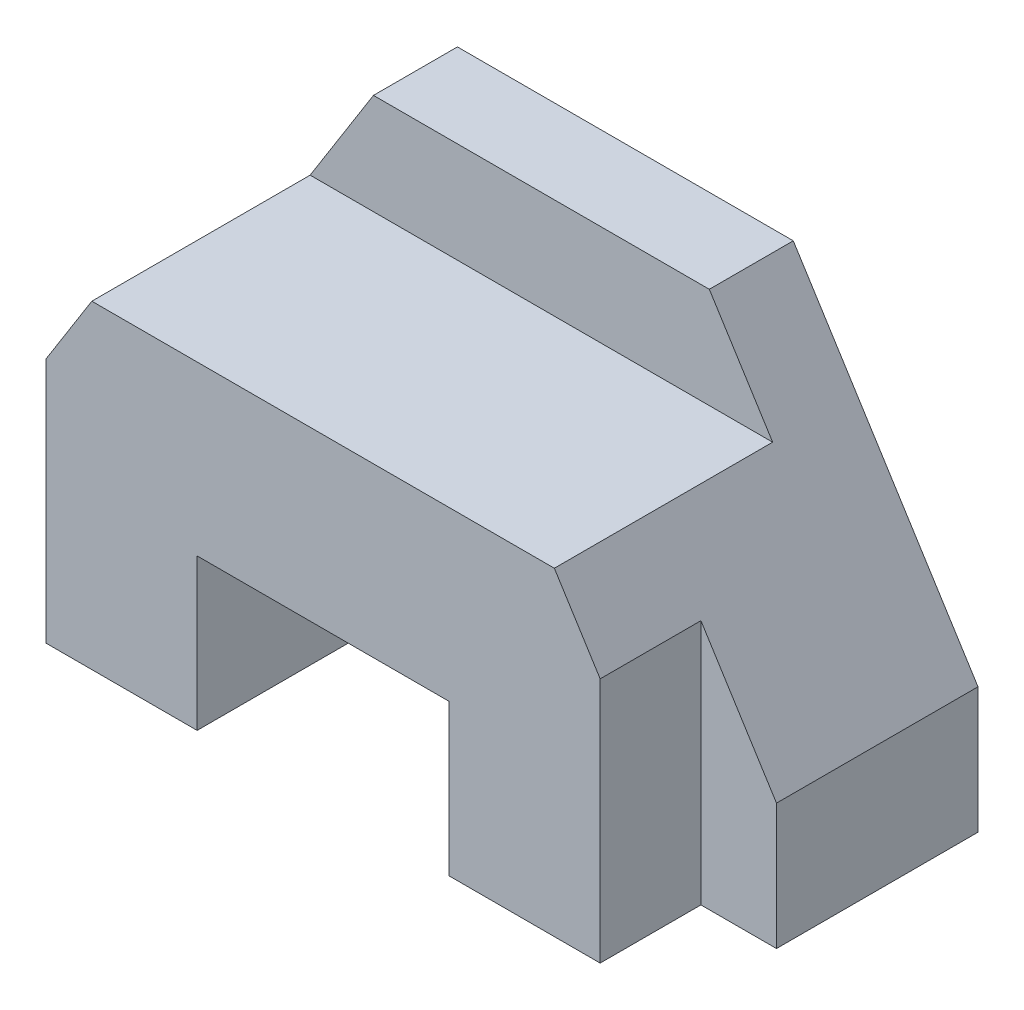
ISO-10303-21;
HEADER;
FILE_DESCRIPTION(('STEP AP214'),'2;1');
FILE_NAME('part.step','',(''),(''),'','','');
FILE_SCHEMA(('AUTOMOTIVE_DESIGN { 1 0 10303 214 1 1 1 1 }'));
ENDSEC;
DATA;
#1=APPLICATION_CONTEXT('core data for automotive mechanical design processes');
#2=APPLICATION_PROTOCOL_DEFINITION('international standard','automotive_design',2000,#1);
#3=PRODUCT_CONTEXT('',#1,'mechanical');
#4=PRODUCT('Part','Part','',(#3));
#5=PRODUCT_RELATED_PRODUCT_CATEGORY('part','',(#4));
#6=PRODUCT_DEFINITION_FORMATION('','',#4);
#7=PRODUCT_DEFINITION_CONTEXT('part definition',#1,'design');
#8=PRODUCT_DEFINITION('design','',#6,#7);
#9=PRODUCT_DEFINITION_SHAPE('','',#8);
#10=(LENGTH_UNIT() NAMED_UNIT(*) SI_UNIT(.MILLI.,.METRE.));
#11=(NAMED_UNIT(*) PLANE_ANGLE_UNIT() SI_UNIT($,.RADIAN.));
#12=(NAMED_UNIT(*) SI_UNIT($,.STERADIAN.) SOLID_ANGLE_UNIT());
#13=UNCERTAINTY_MEASURE_WITH_UNIT(LENGTH_MEASURE(1.E-05),#10,'distance_accuracy_value','');
#14=(GEOMETRIC_REPRESENTATION_CONTEXT(3) GLOBAL_UNCERTAINTY_ASSIGNED_CONTEXT((#13)) GLOBAL_UNIT_ASSIGNED_CONTEXT((#10,
#11,#12)) REPRESENTATION_CONTEXT('',''));
#15=CARTESIAN_POINT('',(0.,0.,0.));
#16=DIRECTION('',(0.,0.,1.));
#17=DIRECTION('',(1.,0.,0.));
#18=AXIS2_PLACEMENT_3D('',#15,#16,#17);
#19=CARTESIAN_POINT('',(-42.,-15.,36.));
#20=DIRECTION('',(0.,1.,0.));
#21=DIRECTION('',(0.,0.,1.));
#22=AXIS2_PLACEMENT_3D('',#19,#20,#21);
#23=PLANE('',#22);
#24=DIRECTION('',(1.,0.,0.));
#25=VECTOR('',#24,1.);
#26=CARTESIAN_POINT('',(-42.,-15.,0.));
#27=LINE('',#26,#25);
#28=CARTESIAN_POINT('',(-42.,-15.,0.));
#29=VERTEX_POINT('',#28);
#30=CARTESIAN_POINT('',(-15.,-15.,0.));
#31=VERTEX_POINT('',#30);
#32=EDGE_CURVE('E166',#29,#31,#27,.T.);
#33=ORIENTED_EDGE('',*,*,#32,.T.);
#34=DIRECTION('',(0.,0.,1.));
#35=VECTOR('',#34,1.);
#36=CARTESIAN_POINT('',(-15.,-15.,0.));
#37=LINE('',#36,#35);
#38=CARTESIAN_POINT('',(-15.,-15.,36.));
#39=VERTEX_POINT('',#38);
#40=EDGE_CURVE('E150',#31,#39,#37,.T.);
#41=ORIENTED_EDGE('',*,*,#40,.T.);
#42=DIRECTION('',(1.,0.,0.));
#43=VECTOR('',#42,1.);
#44=CARTESIAN_POINT('',(-42.,-15.,36.));
#45=LINE('',#44,#43);
#46=CARTESIAN_POINT('',(-33.,-15.,36.));
#47=VERTEX_POINT('',#46);
#48=EDGE_CURVE('E187',#47,#39,#45,.T.);
#49=ORIENTED_EDGE('',*,*,#48,.F.);
#50=DIRECTION('',(0.,0.,1.));
#51=VECTOR('',#50,1.);
#52=CARTESIAN_POINT('',(-33.,-15.,24.));
#53=LINE('',#52,#51);
#54=CARTESIAN_POINT('',(-33.,-15.,24.));
#55=VERTEX_POINT('',#54);
#56=EDGE_CURVE('E253',#55,#47,#53,.T.);
#57=ORIENTED_EDGE('',*,*,#56,.F.);
#58=DIRECTION('',(1.,0.,0.));
#59=VECTOR('',#58,1.);
#60=CARTESIAN_POINT('',(-42.,-15.,24.));
#61=LINE('',#60,#59);
#62=CARTESIAN_POINT('',(-42.,-15.,24.));
#63=VERTEX_POINT('',#62);
#64=EDGE_CURVE('E242',#63,#55,#61,.T.);
#65=ORIENTED_EDGE('',*,*,#64,.F.);
#66=DIRECTION('',(0.,0.,-1.));
#67=VECTOR('',#66,1.);
#68=CARTESIAN_POINT('',(-42.,-15.,36.));
#69=LINE('',#68,#67);
#70=EDGE_CURVE('E173',#63,#29,#69,.T.);
#71=ORIENTED_EDGE('',*,*,#70,.T.);
#72=EDGE_LOOP('',(#33,#41,#49,#57,#65,#71));
#73=FACE_BOUND('',#72,.T.);
#74=ADVANCED_FACE('F37',(#73),#23,.F.);
#75=CARTESIAN_POINT('',(-42.,-15.,36.));
#76=DIRECTION('',(1.,0.,0.));
#77=DIRECTION('',(0.,1.,0.));
#78=AXIS2_PLACEMENT_3D('',#75,#76,#77);
#79=PLANE('',#78);
#80=DIRECTION('',(0.,-1.,0.));
#81=VECTOR('',#80,1.);
#82=CARTESIAN_POINT('',(-42.,0.,24.));
#83=LINE('',#82,#81);
#84=CARTESIAN_POINT('',(-42.,0.,24.));
#85=VERTEX_POINT('',#84);
#86=EDGE_CURVE('E251',#85,#63,#83,.T.);
#87=ORIENTED_EDGE('',*,*,#86,.F.);
#88=DIRECTION('',(0.,0.,-1.));
#89=VECTOR('',#88,1.);
#90=CARTESIAN_POINT('',(-42.,0.,36.));
#91=LINE('',#90,#89);
#92=CARTESIAN_POINT('',(-42.,0.,0.));
#93=VERTEX_POINT('',#92);
#94=EDGE_CURVE('E189',#85,#93,#91,.T.);
#95=ORIENTED_EDGE('',*,*,#94,.T.);
#96=DIRECTION('',(0.,-1.,0.));
#97=VECTOR('',#96,1.);
#98=CARTESIAN_POINT('',(-42.,-15.,0.));
#99=LINE('',#98,#97);
#100=EDGE_CURVE('E180',#93,#29,#99,.T.);
#101=ORIENTED_EDGE('',*,*,#100,.T.);
#102=ORIENTED_EDGE('',*,*,#70,.F.);
#103=EDGE_LOOP('',(#87,#95,#101,#102));
#104=FACE_BOUND('',#103,.T.);
#105=ADVANCED_FACE('F322',(#104),#79,.F.);
#106=CARTESIAN_POINT('',(20.,35.,36.));
#107=DIRECTION('',(0.,-1.,0.));
#108=DIRECTION('',(1.,0.,0.));
#109=AXIS2_PLACEMENT_3D('',#106,#107,#108);
#110=PLANE('',#109);
#111=DIRECTION('',(-1.,0.,0.));
#112=VECTOR('',#111,1.);
#113=CARTESIAN_POINT('',(0.,35.,10.));
#114=LINE('',#113,#112);
#115=CARTESIAN_POINT('',(20.,35.,10.));
#116=VERTEX_POINT('',#115);
#117=CARTESIAN_POINT('',(-20.,35.,10.));
#118=VERTEX_POINT('',#117);
#119=EDGE_CURVE('E202',#116,#118,#114,.T.);
#120=ORIENTED_EDGE('',*,*,#119,.F.);
#121=DIRECTION('',(0.,0.,-1.));
#122=VECTOR('',#121,1.);
#123=CARTESIAN_POINT('',(20.,35.,36.));
#124=LINE('',#123,#122);
#125=CARTESIAN_POINT('',(20.,35.,0.));
#126=VERTEX_POINT('',#125);
#127=EDGE_CURVE('E45',#116,#126,#124,.T.);
#128=ORIENTED_EDGE('',*,*,#127,.T.);
#129=DIRECTION('',(-1.,0.,0.));
#130=VECTOR('',#129,1.);
#131=CARTESIAN_POINT('',(20.,35.,0.));
#132=LINE('',#131,#130);
#133=CARTESIAN_POINT('',(-20.,35.,0.));
#134=VERTEX_POINT('',#133);
#135=EDGE_CURVE('E200',#126,#134,#132,.T.);
#136=ORIENTED_EDGE('',*,*,#135,.T.);
#137=DIRECTION('',(0.,0.,-1.));
#138=VECTOR('',#137,1.);
#139=CARTESIAN_POINT('',(-20.,35.,36.));
#140=LINE('',#139,#138);
#141=EDGE_CURVE('E191',#118,#134,#140,.T.);
#142=ORIENTED_EDGE('',*,*,#141,.F.);
#143=EDGE_LOOP('',(#120,#128,#136,#142));
#144=FACE_BOUND('',#143,.T.);
#145=ADVANCED_FACE('F197',(#144),#110,.F.);
#146=CARTESIAN_POINT('',(42.,-15.,36.));
#147=DIRECTION('',(-1.,0.,0.));
#148=DIRECTION('',(0.,0.,1.));
#149=AXIS2_PLACEMENT_3D('',#146,#147,#148);
#150=PLANE('',#149);
#151=DIRECTION('',(0.,0.,-1.));
#152=VECTOR('',#151,1.);
#153=CARTESIAN_POINT('',(42.,0.,36.));
#154=LINE('',#153,#152);
#155=CARTESIAN_POINT('',(42.,0.,24.));
#156=VERTEX_POINT('',#155);
#157=CARTESIAN_POINT('',(42.,0.,0.));
#158=VERTEX_POINT('',#157);
#159=EDGE_CURVE('E11',#156,#158,#154,.T.);
#160=ORIENTED_EDGE('',*,*,#159,.F.);
#161=DIRECTION('',(0.,1.,0.));
#162=VECTOR('',#161,1.);
#163=CARTESIAN_POINT('',(42.,-15.,24.));
#164=LINE('',#163,#162);
#165=CARTESIAN_POINT('',(42.,-15.,24.));
#166=VERTEX_POINT('',#165);
#167=EDGE_CURVE('E262',#166,#156,#164,.T.);
#168=ORIENTED_EDGE('',*,*,#167,.F.);
#169=DIRECTION('',(0.,0.,-1.));
#170=VECTOR('',#169,1.);
#171=CARTESIAN_POINT('',(42.,-15.,36.));
#172=LINE('',#171,#170);
#173=CARTESIAN_POINT('',(42.,-15.,0.));
#174=VERTEX_POINT('',#173);
#175=EDGE_CURVE('E184',#166,#174,#172,.T.);
#176=ORIENTED_EDGE('',*,*,#175,.T.);
#177=DIRECTION('',(0.,1.,0.));
#178=VECTOR('',#177,1.);
#179=CARTESIAN_POINT('',(42.,-15.,0.));
#180=LINE('',#179,#178);
#181=EDGE_CURVE('E213',#174,#158,#180,.T.);
#182=ORIENTED_EDGE('',*,*,#181,.T.);
#183=EDGE_LOOP('',(#160,#168,#176,#182));
#184=FACE_BOUND('',#183,.T.);
#185=ADVANCED_FACE('F39',(#184),#150,.F.);
#186=CARTESIAN_POINT('',(42.,0.,36.));
#187=DIRECTION('',(-0.846636549211005,-0.532171545218346,0.));
#188=DIRECTION('',(0.532171545218346,-0.846636549211005,0.));
#189=AXIS2_PLACEMENT_3D('',#186,#187,#188);
#190=PLANE('',#189);
#191=DIRECTION('',(-0.532171545218346,0.846636549211005,0.));
#192=VECTOR('',#191,1.);
#193=CARTESIAN_POINT('',(42.,0.,36.));
#194=LINE('',#193,#192);
#195=CARTESIAN_POINT('',(33.,14.3181818181818,36.));
#196=VERTEX_POINT('',#195);
#197=CARTESIAN_POINT('',(27.5428571428571,23.,36.));
#198=VERTEX_POINT('',#197);
#199=EDGE_CURVE('E175',#196,#198,#194,.T.);
#200=ORIENTED_EDGE('',*,*,#199,.F.);
#201=DIRECTION('',(0.,0.,1.));
#202=VECTOR('',#201,1.);
#203=CARTESIAN_POINT('',(33.,14.3181818181818,24.));
#204=LINE('',#203,#202);
#205=CARTESIAN_POINT('',(33.,14.3181818181818,24.));
#206=VERTEX_POINT('',#205);
#207=EDGE_CURVE('E60',#206,#196,#204,.T.);
#208=ORIENTED_EDGE('',*,*,#207,.F.);
#209=DIRECTION('',(-0.532171545218346,0.846636549211005,0.));
#210=VECTOR('',#209,1.);
#211=CARTESIAN_POINT('',(42.,0.,24.));
#212=LINE('',#211,#210);
#213=EDGE_CURVE('E266',#156,#206,#212,.T.);
#214=ORIENTED_EDGE('',*,*,#213,.F.);
#215=ORIENTED_EDGE('',*,*,#159,.T.);
#216=DIRECTION('',(-0.532171545218346,0.846636549211005,0.));
#217=VECTOR('',#216,1.);
#218=CARTESIAN_POINT('',(42.,0.,0.));
#219=LINE('',#218,#217);
#220=EDGE_CURVE('E206',#158,#126,#219,.T.);
#221=ORIENTED_EDGE('',*,*,#220,.T.);
#222=ORIENTED_EDGE('',*,*,#127,.F.);
#223=DIRECTION('',(-0.532171545218346,0.846636549211005,0.));
#224=VECTOR('',#223,1.);
#225=CARTESIAN_POINT('',(30.1053247513166,18.9233469865418,10.));
#226=LINE('',#225,#224);
#227=CARTESIAN_POINT('',(27.5428571428571,23.,10.));
#228=VERTEX_POINT('',#227);
#229=EDGE_CURVE('E235',#228,#116,#226,.T.);
#230=ORIENTED_EDGE('',*,*,#229,.F.);
#231=DIRECTION('',(0.,0.,1.));
#232=VECTOR('',#231,1.);
#233=CARTESIAN_POINT('',(27.5428571428571,23.,10.));
#234=LINE('',#233,#232);
#235=EDGE_CURVE('E220',#228,#198,#234,.T.);
#236=ORIENTED_EDGE('',*,*,#235,.T.);
#237=EDGE_LOOP('',(#200,#208,#214,#215,#221,#222,#230,#236));
#238=FACE_BOUND('',#237,.T.);
#239=ADVANCED_FACE('F208',(#238),#190,.F.);
#240=CARTESIAN_POINT('',(-42.,0.,36.));
#241=DIRECTION('',(0.846636549211005,-0.532171545218345,0.));
#242=DIRECTION('',(0.532171545218346,0.846636549211005,0.));
#243=AXIS2_PLACEMENT_3D('',#240,#241,#242);
#244=PLANE('',#243);
#245=DIRECTION('',(-0.532171545218345,-0.846636549211005,0.));
#246=VECTOR('',#245,1.);
#247=CARTESIAN_POINT('',(-33.,14.3181818181818,24.));
#248=LINE('',#247,#246);
#249=CARTESIAN_POINT('',(-33.,14.3181818181818,24.));
#250=VERTEX_POINT('',#249);
#251=EDGE_CURVE('E249',#250,#85,#248,.T.);
#252=ORIENTED_EDGE('',*,*,#251,.F.);
#253=DIRECTION('',(0.,0.,1.));
#254=VECTOR('',#253,1.);
#255=CARTESIAN_POINT('',(-33.,14.3181818181818,24.));
#256=LINE('',#255,#254);
#257=CARTESIAN_POINT('',(-33.,14.3181818181818,36.));
#258=VERTEX_POINT('',#257);
#259=EDGE_CURVE('E256',#250,#258,#256,.T.);
#260=ORIENTED_EDGE('',*,*,#259,.T.);
#261=DIRECTION('',(-0.532171545218346,-0.846636549211005,0.));
#262=VECTOR('',#261,1.);
#263=CARTESIAN_POINT('',(-42.,0.,36.));
#264=LINE('',#263,#262);
#265=CARTESIAN_POINT('',(-27.5428571428571,23.,36.));
#266=VERTEX_POINT('',#265);
#267=EDGE_CURVE('E178',#266,#258,#264,.T.);
#268=ORIENTED_EDGE('',*,*,#267,.F.);
#269=DIRECTION('',(0.,0.,1.));
#270=VECTOR('',#269,1.);
#271=CARTESIAN_POINT('',(-27.5428571428571,23.,10.));
#272=LINE('',#271,#270);
#273=CARTESIAN_POINT('',(-27.5428571428571,23.,10.));
#274=VERTEX_POINT('',#273);
#275=EDGE_CURVE('E225',#274,#266,#272,.T.);
#276=ORIENTED_EDGE('',*,*,#275,.F.);
#277=DIRECTION('',(-0.532171545218346,-0.846636549211005,0.));
#278=VECTOR('',#277,1.);
#279=CARTESIAN_POINT('',(-30.1053247513166,18.9233469865418,10.));
#280=LINE('',#279,#278);
#281=EDGE_CURVE('E232',#118,#274,#280,.T.);
#282=ORIENTED_EDGE('',*,*,#281,.F.);
#283=ORIENTED_EDGE('',*,*,#141,.T.);
#284=DIRECTION('',(-0.532171545218346,-0.846636549211005,0.));
#285=VECTOR('',#284,1.);
#286=CARTESIAN_POINT('',(-42.,0.,0.));
#287=LINE('',#286,#285);
#288=EDGE_CURVE('E216',#134,#93,#287,.T.);
#289=ORIENTED_EDGE('',*,*,#288,.T.);
#290=ORIENTED_EDGE('',*,*,#94,.F.);
#291=EDGE_LOOP('',(#252,#260,#268,#276,#282,#283,#289,#290));
#292=FACE_BOUND('',#291,.T.);
#293=ADVANCED_FACE('F312',(#292),#244,.F.);
#294=CARTESIAN_POINT('',(15.,-15.,36.));
#295=VERTEX_POINT('',#294);
#296=CARTESIAN_POINT('',(33.,-15.,36.));
#297=VERTEX_POINT('',#296);
#298=EDGE_CURVE('E222',#295,#297,#45,.T.);
#299=ORIENTED_EDGE('',*,*,#298,.F.);
#300=DIRECTION('',(0.,0.,1.));
#301=VECTOR('',#300,1.);
#302=CARTESIAN_POINT('',(15.,-15.,0.));
#303=LINE('',#302,#301);
#304=CARTESIAN_POINT('',(15.,-15.,0.));
#305=VERTEX_POINT('',#304);
#306=EDGE_CURVE('E160',#305,#295,#303,.T.);
#307=ORIENTED_EDGE('',*,*,#306,.F.);
#308=EDGE_CURVE('E176',#305,#174,#27,.T.);
#309=ORIENTED_EDGE('',*,*,#308,.T.);
#310=ORIENTED_EDGE('',*,*,#175,.F.);
#311=DIRECTION('',(1.,0.,0.));
#312=VECTOR('',#311,1.);
#313=CARTESIAN_POINT('',(33.,-15.,24.));
#314=LINE('',#313,#312);
#315=CARTESIAN_POINT('',(33.,-15.,24.));
#316=VERTEX_POINT('',#315);
#317=EDGE_CURVE('E268',#316,#166,#314,.T.);
#318=ORIENTED_EDGE('',*,*,#317,.F.);
#319=DIRECTION('',(0.,0.,1.));
#320=VECTOR('',#319,1.);
#321=CARTESIAN_POINT('',(33.,-15.,24.));
#322=LINE('',#321,#320);
#323=EDGE_CURVE('E233',#316,#297,#322,.T.);
#324=ORIENTED_EDGE('',*,*,#323,.T.);
#325=EDGE_LOOP('',(#299,#307,#309,#310,#318,#324));
#326=FACE_BOUND('',#325,.T.);
#327=ADVANCED_FACE('F293',(#326),#23,.F.);
#328=CARTESIAN_POINT('',(0.,0.,36.));
#329=DIRECTION('',(0.,0.,1.));
#330=DIRECTION('',(1.,0.,0.));
#331=AXIS2_PLACEMENT_3D('',#328,#329,#330);
#332=PLANE('',#331);
#333=DIRECTION('',(0.,-1.,0.));
#334=VECTOR('',#333,1.);
#335=CARTESIAN_POINT('',(-15.,-15.,36.));
#336=LINE('',#335,#334);
#337=CARTESIAN_POINT('',(-15.,2.99999999999999,36.));
#338=VERTEX_POINT('',#337);
#339=EDGE_CURVE('E155',#338,#39,#336,.T.);
#340=ORIENTED_EDGE('',*,*,#339,.F.);
#341=DIRECTION('',(-1.,0.,0.));
#342=VECTOR('',#341,1.);
#343=CARTESIAN_POINT('',(-15.,2.99999999999999,36.));
#344=LINE('',#343,#342);
#345=CARTESIAN_POINT('',(15.,3.,36.));
#346=VERTEX_POINT('',#345);
#347=EDGE_CURVE('E169',#346,#338,#344,.T.);
#348=ORIENTED_EDGE('',*,*,#347,.F.);
#349=DIRECTION('',(0.,1.,0.));
#350=VECTOR('',#349,1.);
#351=CARTESIAN_POINT('',(15.,-15.,36.));
#352=LINE('',#351,#350);
#353=EDGE_CURVE('E281',#295,#346,#352,.T.);
#354=ORIENTED_EDGE('',*,*,#353,.F.);
#355=ORIENTED_EDGE('',*,*,#298,.T.);
#356=DIRECTION('',(0.,-1.,0.));
#357=VECTOR('',#356,1.);
#358=CARTESIAN_POINT('',(33.,14.3181818181818,36.));
#359=LINE('',#358,#357);
#360=EDGE_CURVE('E255',#196,#297,#359,.T.);
#361=ORIENTED_EDGE('',*,*,#360,.F.);
#362=ORIENTED_EDGE('',*,*,#199,.T.);
#363=DIRECTION('',(1.,0.,0.));
#364=VECTOR('',#363,1.);
#365=CARTESIAN_POINT('',(0.,23.,36.));
#366=LINE('',#365,#364);
#367=EDGE_CURVE('E229',#266,#198,#366,.T.);
#368=ORIENTED_EDGE('',*,*,#367,.F.);
#369=ORIENTED_EDGE('',*,*,#267,.T.);
#370=DIRECTION('',(0.,1.,0.));
#371=VECTOR('',#370,1.);
#372=CARTESIAN_POINT('',(-33.,-15.,36.));
#373=LINE('',#372,#371);
#374=EDGE_CURVE('E245',#47,#258,#373,.T.);
#375=ORIENTED_EDGE('',*,*,#374,.F.);
#376=ORIENTED_EDGE('',*,*,#48,.T.);
#377=EDGE_LOOP('',(#340,#348,#354,#355,#361,#362,#368,#369,#375,#376));
#378=FACE_BOUND('',#377,.T.);
#379=ADVANCED_FACE('F297',(#378),#332,.T.);
#380=CARTESIAN_POINT('',(0.,0.,0.));
#381=DIRECTION('',(0.,0.,1.));
#382=DIRECTION('',(1.,0.,0.));
#383=AXIS2_PLACEMENT_3D('',#380,#381,#382);
#384=PLANE('',#383);
#385=DIRECTION('',(-1.,0.,0.));
#386=VECTOR('',#385,1.);
#387=CARTESIAN_POINT('',(-15.,2.99999999999999,0.));
#388=LINE('',#387,#386);
#389=CARTESIAN_POINT('',(15.,3.,0.));
#390=VERTEX_POINT('',#389);
#391=CARTESIAN_POINT('',(-15.,2.99999999999999,0.));
#392=VERTEX_POINT('',#391);
#393=EDGE_CURVE('E52',#390,#392,#388,.T.);
#394=ORIENTED_EDGE('',*,*,#393,.T.);
#395=DIRECTION('',(0.,-1.,0.));
#396=VECTOR('',#395,1.);
#397=CARTESIAN_POINT('',(-15.,-15.,0.));
#398=LINE('',#397,#396);
#399=EDGE_CURVE('E153',#392,#31,#398,.T.);
#400=ORIENTED_EDGE('',*,*,#399,.T.);
#401=ORIENTED_EDGE('',*,*,#32,.F.);
#402=ORIENTED_EDGE('',*,*,#100,.F.);
#403=ORIENTED_EDGE('',*,*,#288,.F.);
#404=ORIENTED_EDGE('',*,*,#135,.F.);
#405=ORIENTED_EDGE('',*,*,#220,.F.);
#406=ORIENTED_EDGE('',*,*,#181,.F.);
#407=ORIENTED_EDGE('',*,*,#308,.F.);
#408=DIRECTION('',(0.,1.,0.));
#409=VECTOR('',#408,1.);
#410=CARTESIAN_POINT('',(15.,-15.,0.));
#411=LINE('',#410,#409);
#412=EDGE_CURVE('E168',#305,#390,#411,.T.);
#413=ORIENTED_EDGE('',*,*,#412,.T.);
#414=EDGE_LOOP('',(#394,#400,#401,#402,#403,#404,#405,#406,#407,#413));
#415=FACE_BOUND('',#414,.T.);
#416=ADVANCED_FACE('F164',(#415),#384,.F.);
#417=CARTESIAN_POINT('',(0.,23.,10.));
#418=DIRECTION('',(0.,-1.,0.));
#419=DIRECTION('',(0.,0.,-1.));
#420=AXIS2_PLACEMENT_3D('',#417,#418,#419);
#421=PLANE('',#420);
#422=ORIENTED_EDGE('',*,*,#367,.T.);
#423=ORIENTED_EDGE('',*,*,#235,.F.);
#424=DIRECTION('',(1.,0.,0.));
#425=VECTOR('',#424,1.);
#426=CARTESIAN_POINT('',(0.,23.,10.));
#427=LINE('',#426,#425);
#428=EDGE_CURVE('E237',#274,#228,#427,.T.);
#429=ORIENTED_EDGE('',*,*,#428,.F.);
#430=ORIENTED_EDGE('',*,*,#275,.T.);
#431=EDGE_LOOP('',(#422,#423,#429,#430));
#432=FACE_BOUND('',#431,.T.);
#433=ADVANCED_FACE('F307',(#432),#421,.F.);
#434=CARTESIAN_POINT('',(0.,0.,10.));
#435=DIRECTION('',(0.,0.,1.));
#436=DIRECTION('',(1.,0.,0.));
#437=AXIS2_PLACEMENT_3D('',#434,#435,#436);
#438=PLANE('',#437);
#439=ORIENTED_EDGE('',*,*,#281,.T.);
#440=ORIENTED_EDGE('',*,*,#428,.T.);
#441=ORIENTED_EDGE('',*,*,#229,.T.);
#442=ORIENTED_EDGE('',*,*,#119,.T.);
#443=EDGE_LOOP('',(#439,#440,#441,#442));
#444=FACE_BOUND('',#443,.T.);
#445=ADVANCED_FACE('F355',(#444),#438,.T.);
#446=CARTESIAN_POINT('',(-33.,-15.,24.));
#447=DIRECTION('',(1.,0.,0.));
#448=DIRECTION('',(0.,0.,-1.));
#449=AXIS2_PLACEMENT_3D('',#446,#447,#448);
#450=PLANE('',#449);
#451=ORIENTED_EDGE('',*,*,#374,.T.);
#452=ORIENTED_EDGE('',*,*,#259,.F.);
#453=DIRECTION('',(0.,1.,0.));
#454=VECTOR('',#453,1.);
#455=CARTESIAN_POINT('',(-33.,-15.,24.));
#456=LINE('',#455,#454);
#457=EDGE_CURVE('E246',#55,#250,#456,.T.);
#458=ORIENTED_EDGE('',*,*,#457,.F.);
#459=ORIENTED_EDGE('',*,*,#56,.T.);
#460=EDGE_LOOP('',(#451,#452,#458,#459));
#461=FACE_BOUND('',#460,.T.);
#462=ADVANCED_FACE('F316',(#461),#450,.F.);
#463=CARTESIAN_POINT('',(0.,0.,24.));
#464=DIRECTION('',(0.,0.,1.));
#465=DIRECTION('',(1.,0.,0.));
#466=AXIS2_PLACEMENT_3D('',#463,#464,#465);
#467=PLANE('',#466);
#468=ORIENTED_EDGE('',*,*,#64,.T.);
#469=ORIENTED_EDGE('',*,*,#457,.T.);
#470=ORIENTED_EDGE('',*,*,#251,.T.);
#471=ORIENTED_EDGE('',*,*,#86,.T.);
#472=EDGE_LOOP('',(#468,#469,#470,#471));
#473=FACE_BOUND('',#472,.T.);
#474=ADVANCED_FACE('F318',(#473),#467,.T.);
#475=CARTESIAN_POINT('',(33.,14.3181818181818,24.));
#476=DIRECTION('',(-1.,0.,0.));
#477=DIRECTION('',(0.,0.,1.));
#478=AXIS2_PLACEMENT_3D('',#475,#476,#477);
#479=PLANE('',#478);
#480=ORIENTED_EDGE('',*,*,#360,.T.);
#481=ORIENTED_EDGE('',*,*,#323,.F.);
#482=DIRECTION('',(0.,-1.,0.));
#483=VECTOR('',#482,1.);
#484=CARTESIAN_POINT('',(33.,14.3181818181818,24.));
#485=LINE('',#484,#483);
#486=EDGE_CURVE('E270',#206,#316,#485,.T.);
#487=ORIENTED_EDGE('',*,*,#486,.F.);
#488=ORIENTED_EDGE('',*,*,#207,.T.);
#489=EDGE_LOOP('',(#480,#481,#487,#488));
#490=FACE_BOUND('',#489,.T.);
#491=ADVANCED_FACE('F299',(#490),#479,.F.);
#492=CARTESIAN_POINT('',(0.,0.,24.));
#493=DIRECTION('',(0.,0.,-1.));
#494=DIRECTION('',(-1.,0.,0.));
#495=AXIS2_PLACEMENT_3D('',#492,#493,#494);
#496=PLANE('',#495);
#497=ORIENTED_EDGE('',*,*,#213,.T.);
#498=ORIENTED_EDGE('',*,*,#486,.T.);
#499=ORIENTED_EDGE('',*,*,#317,.T.);
#500=ORIENTED_EDGE('',*,*,#167,.T.);
#501=EDGE_LOOP('',(#497,#498,#499,#500));
#502=FACE_BOUND('',#501,.T.);
#503=ADVANCED_FACE('F301',(#502),#496,.F.);
#504=CARTESIAN_POINT('',(-15.,-15.,0.));
#505=DIRECTION('',(-1.,0.,0.));
#506=DIRECTION('',(0.,-1.,0.));
#507=AXIS2_PLACEMENT_3D('',#504,#505,#506);
#508=PLANE('',#507);
#509=ORIENTED_EDGE('',*,*,#339,.T.);
#510=ORIENTED_EDGE('',*,*,#40,.F.);
#511=ORIENTED_EDGE('',*,*,#399,.F.);
#512=DIRECTION('',(0.,0.,1.));
#513=VECTOR('',#512,1.);
#514=CARTESIAN_POINT('',(-15.,2.99999999999999,0.));
#515=LINE('',#514,#513);
#516=EDGE_CURVE('E259',#392,#338,#515,.T.);
#517=ORIENTED_EDGE('',*,*,#516,.T.);
#518=EDGE_LOOP('',(#509,#510,#511,#517));
#519=FACE_BOUND('',#518,.T.);
#520=ADVANCED_FACE('F152',(#519),#508,.F.);
#521=CARTESIAN_POINT('',(-15.,2.99999999999999,0.));
#522=DIRECTION('',(0.,1.,0.));
#523=DIRECTION('',(-1.,0.,0.));
#524=AXIS2_PLACEMENT_3D('',#521,#522,#523);
#525=PLANE('',#524);
#526=ORIENTED_EDGE('',*,*,#347,.T.);
#527=ORIENTED_EDGE('',*,*,#516,.F.);
#528=ORIENTED_EDGE('',*,*,#393,.F.);
#529=DIRECTION('',(0.,0.,1.));
#530=VECTOR('',#529,1.);
#531=CARTESIAN_POINT('',(15.,3.,0.));
#532=LINE('',#531,#530);
#533=EDGE_CURVE('E276',#390,#346,#532,.T.);
#534=ORIENTED_EDGE('',*,*,#533,.T.);
#535=EDGE_LOOP('',(#526,#527,#528,#534));
#536=FACE_BOUND('',#535,.T.);
#537=ADVANCED_FACE('F422',(#536),#525,.F.);
#538=CARTESIAN_POINT('',(15.,-15.,0.));
#539=DIRECTION('',(1.,0.,0.));
#540=DIRECTION('',(0.,0.,-1.));
#541=AXIS2_PLACEMENT_3D('',#538,#539,#540);
#542=PLANE('',#541);
#543=ORIENTED_EDGE('',*,*,#353,.T.);
#544=ORIENTED_EDGE('',*,*,#533,.F.);
#545=ORIENTED_EDGE('',*,*,#412,.F.);
#546=ORIENTED_EDGE('',*,*,#306,.T.);
#547=EDGE_LOOP('',(#543,#544,#545,#546));
#548=FACE_BOUND('',#547,.T.);
#549=ADVANCED_FACE('F289',(#548),#542,.F.);
#550=CLOSED_SHELL('',(#74,#105,#145,#185,#239,#293,#327,#379,#416,#433,#445,#462,#474,#491,#503,
#520,#537,#549));
#551=MANIFOLD_SOLID_BREP('B2',#550);
#552=ADVANCED_BREP_SHAPE_REPRESENTATION('',(#18,#551),#14);
#553=SHAPE_DEFINITION_REPRESENTATION(#9,#552);
ENDSEC;
END-ISO-10303-21;
